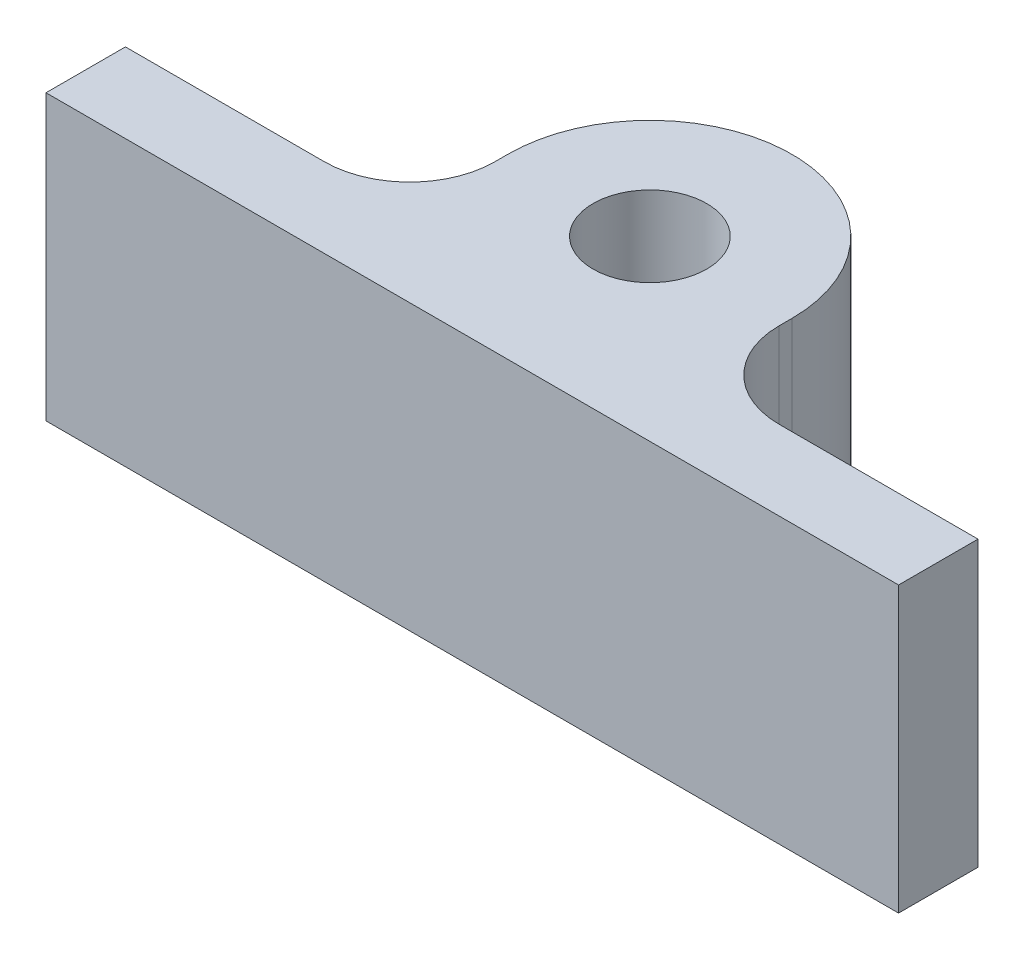
ISO-10303-21;
HEADER;
FILE_DESCRIPTION(('STEP AP214'),'2;1');
FILE_NAME('part.step','',(''),(''),'','','');
FILE_SCHEMA(('AUTOMOTIVE_DESIGN { 1 0 10303 214 1 1 1 1 }'));
ENDSEC;
DATA;
#1=APPLICATION_CONTEXT('core data for automotive mechanical design processes');
#2=APPLICATION_PROTOCOL_DEFINITION('international standard','automotive_design',2000,#1);
#3=PRODUCT_CONTEXT('',#1,'mechanical');
#4=PRODUCT('Part','Part','',(#3));
#5=PRODUCT_RELATED_PRODUCT_CATEGORY('part','',(#4));
#6=PRODUCT_DEFINITION_FORMATION('','',#4);
#7=PRODUCT_DEFINITION_CONTEXT('part definition',#1,'design');
#8=PRODUCT_DEFINITION('design','',#6,#7);
#9=PRODUCT_DEFINITION_SHAPE('','',#8);
#10=(LENGTH_UNIT() NAMED_UNIT(*) SI_UNIT(.MILLI.,.METRE.));
#11=(NAMED_UNIT(*) PLANE_ANGLE_UNIT() SI_UNIT($,.RADIAN.));
#12=(NAMED_UNIT(*) SI_UNIT($,.STERADIAN.) SOLID_ANGLE_UNIT());
#13=UNCERTAINTY_MEASURE_WITH_UNIT(LENGTH_MEASURE(1.E-05),#10,'distance_accuracy_value','');
#14=(GEOMETRIC_REPRESENTATION_CONTEXT(3) GLOBAL_UNCERTAINTY_ASSIGNED_CONTEXT((#13)) GLOBAL_UNIT_ASSIGNED_CONTEXT((#10,
#11,#12)) REPRESENTATION_CONTEXT('',''));
#15=CARTESIAN_POINT('',(0.,0.,0.));
#16=DIRECTION('',(0.,0.,1.));
#17=DIRECTION('',(1.,0.,0.));
#18=AXIS2_PLACEMENT_3D('',#15,#16,#17);
#19=CARTESIAN_POINT('',(-16.,20.,0.909634979907082));
#20=DIRECTION('',(0.,-1.,0.));
#21=DIRECTION('',(0.,0.,-1.));
#22=AXIS2_PLACEMENT_3D('',#19,#20,#21);
#23=PLANE('',#22);
#24=DIRECTION('',(0.,0.,1.));
#25=VECTOR('',#24,1.);
#26=CARTESIAN_POINT('',(-30.,20.,12.5));
#27=LINE('',#26,#25);
#28=CARTESIAN_POINT('',(-30.,20.,6.90963497990708));
#29=VERTEX_POINT('',#28);
#30=CARTESIAN_POINT('',(-30.,20.,12.5));
#31=VERTEX_POINT('',#30);
#32=EDGE_CURVE('E165',#29,#31,#27,.T.);
#33=ORIENTED_EDGE('',*,*,#32,.T.);
#34=DIRECTION('',(1.,0.,0.));
#35=VECTOR('',#34,1.);
#36=CARTESIAN_POINT('',(30.,20.,12.5));
#37=LINE('',#36,#35);
#38=CARTESIAN_POINT('',(30.,20.,12.5));
#39=VERTEX_POINT('',#38);
#40=EDGE_CURVE('E103',#31,#39,#37,.T.);
#41=ORIENTED_EDGE('',*,*,#40,.T.);
#42=DIRECTION('',(0.,0.,-1.));
#43=VECTOR('',#42,1.);
#44=CARTESIAN_POINT('',(30.,20.,12.5));
#45=LINE('',#44,#43);
#46=CARTESIAN_POINT('',(30.,20.,6.90963497990707));
#47=VERTEX_POINT('',#46);
#48=EDGE_CURVE('E186',#39,#47,#45,.T.);
#49=ORIENTED_EDGE('',*,*,#48,.T.);
#50=DIRECTION('',(-1.,0.,0.));
#51=VECTOR('',#50,1.);
#52=CARTESIAN_POINT('',(16.,20.,6.90963497990708));
#53=LINE('',#52,#51);
#54=CARTESIAN_POINT('',(16.,20.,6.90963497990708));
#55=VERTEX_POINT('',#54);
#56=EDGE_CURVE('E205',#47,#55,#53,.T.);
#57=ORIENTED_EDGE('',*,*,#56,.T.);
#58=CARTESIAN_POINT('',(16.,20.,0.909634979907076));
#59=DIRECTION('',(0.,-1.,0.));
#60=DIRECTION('',(0.,0.,1.));
#61=AXIS2_PLACEMENT_3D('',#58,#59,#60);
#62=CIRCLE('',#61,6.);
#63=CARTESIAN_POINT('',(10.,20.,0.909634979907032));
#64=VERTEX_POINT('',#63);
#65=EDGE_CURVE('E202',#55,#64,#62,.T.);
#66=ORIENTED_EDGE('',*,*,#65,.T.);
#67=DIRECTION('',(0.,0.,-1.));
#68=VECTOR('',#67,1.);
#69=CARTESIAN_POINT('',(10.,20.,0.));
#70=LINE('',#69,#68);
#71=CARTESIAN_POINT('',(10.,20.,0.));
#72=VERTEX_POINT('',#71);
#73=EDGE_CURVE('E204',#64,#72,#70,.T.);
#74=ORIENTED_EDGE('',*,*,#73,.T.);
#75=CARTESIAN_POINT('',(0.,20.,0.));
#76=DIRECTION('',(0.,1.,0.));
#77=DIRECTION('',(0.,0.,1.));
#78=AXIS2_PLACEMENT_3D('',#75,#76,#77);
#79=CIRCLE('',#78,10.);
#80=CARTESIAN_POINT('',(-10.,20.,0.));
#81=VERTEX_POINT('',#80);
#82=EDGE_CURVE('E128',#72,#81,#79,.T.);
#83=ORIENTED_EDGE('',*,*,#82,.T.);
#84=DIRECTION('',(0.,0.,1.));
#85=VECTOR('',#84,1.);
#86=CARTESIAN_POINT('',(-10.,20.,0.));
#87=LINE('',#86,#85);
#88=CARTESIAN_POINT('',(-10.,20.,0.909634979907039));
#89=VERTEX_POINT('',#88);
#90=EDGE_CURVE('E122',#81,#89,#87,.T.);
#91=ORIENTED_EDGE('',*,*,#90,.T.);
#92=CARTESIAN_POINT('',(-16.,20.,0.909634979907082));
#93=DIRECTION('',(0.,-1.,0.));
#94=DIRECTION('',(0.,0.,-1.));
#95=AXIS2_PLACEMENT_3D('',#92,#93,#94);
#96=CIRCLE('',#95,6.);
#97=CARTESIAN_POINT('',(-16.,20.,6.90963497990708));
#98=VERTEX_POINT('',#97);
#99=EDGE_CURVE('E126',#89,#98,#96,.T.);
#100=ORIENTED_EDGE('',*,*,#99,.T.);
#101=DIRECTION('',(-1.,0.,0.));
#102=VECTOR('',#101,1.);
#103=CARTESIAN_POINT('',(-30.,20.,6.90963497990708));
#104=LINE('',#103,#102);
#105=EDGE_CURVE('E54',#98,#29,#104,.T.);
#106=ORIENTED_EDGE('',*,*,#105,.T.);
#107=EDGE_LOOP('',(#33,#41,#49,#57,#66,#74,#83,#91,#100,#106));
#108=FACE_BOUND('',#107,.T.);
#109=CARTESIAN_POINT('',(0.,20.,0.));
#110=DIRECTION('',(0.,1.,0.));
#111=DIRECTION('',(0.,0.,1.));
#112=AXIS2_PLACEMENT_3D('',#109,#110,#111);
#113=CIRCLE('',#112,4.);
#114=CARTESIAN_POINT('',(0.,20.,4.));
#115=VERTEX_POINT('',#114);
#116=EDGE_CURVE('E150',#115,#115,#113,.T.);
#117=ORIENTED_EDGE('',*,*,#116,.F.);
#118=EDGE_LOOP('',(#117));
#119=FACE_BOUND('',#118,.T.);
#120=ADVANCED_FACE('F37',(#108,#119),#23,.F.);
#121=CARTESIAN_POINT('',(-16.,0.,0.909634979907082));
#122=DIRECTION('',(0.,-1.,0.));
#123=DIRECTION('',(0.,0.,-1.));
#124=AXIS2_PLACEMENT_3D('',#121,#122,#123);
#125=PLANE('',#124);
#126=DIRECTION('',(0.,0.,1.));
#127=VECTOR('',#126,1.);
#128=CARTESIAN_POINT('',(-30.,0.,12.5));
#129=LINE('',#128,#127);
#130=CARTESIAN_POINT('',(-30.,0.,6.90963497990708));
#131=VERTEX_POINT('',#130);
#132=CARTESIAN_POINT('',(-30.,0.,12.5));
#133=VERTEX_POINT('',#132);
#134=EDGE_CURVE('E146',#131,#133,#129,.T.);
#135=ORIENTED_EDGE('',*,*,#134,.F.);
#136=DIRECTION('',(-1.,0.,0.));
#137=VECTOR('',#136,1.);
#138=CARTESIAN_POINT('',(-30.,0.,6.90963497990708));
#139=LINE('',#138,#137);
#140=CARTESIAN_POINT('',(-16.,0.,6.90963497990708));
#141=VERTEX_POINT('',#140);
#142=EDGE_CURVE('E95',#141,#131,#139,.T.);
#143=ORIENTED_EDGE('',*,*,#142,.F.);
#144=CARTESIAN_POINT('',(-16.,0.,0.909634979907082));
#145=DIRECTION('',(0.,-1.,0.));
#146=DIRECTION('',(0.,0.,-1.));
#147=AXIS2_PLACEMENT_3D('',#144,#145,#146);
#148=CIRCLE('',#147,6.);
#149=CARTESIAN_POINT('',(-10.,0.,0.909634979907039));
#150=VERTEX_POINT('',#149);
#151=EDGE_CURVE('E89',#150,#141,#148,.T.);
#152=ORIENTED_EDGE('',*,*,#151,.F.);
#153=DIRECTION('',(0.,0.,1.));
#154=VECTOR('',#153,1.);
#155=CARTESIAN_POINT('',(-10.,0.,0.));
#156=LINE('',#155,#154);
#157=CARTESIAN_POINT('',(-10.,0.,0.));
#158=VERTEX_POINT('',#157);
#159=EDGE_CURVE('E136',#158,#150,#156,.T.);
#160=ORIENTED_EDGE('',*,*,#159,.F.);
#161=CARTESIAN_POINT('',(0.,0.,0.));
#162=DIRECTION('',(0.,1.,0.));
#163=DIRECTION('',(0.,0.,1.));
#164=AXIS2_PLACEMENT_3D('',#161,#162,#163);
#165=CIRCLE('',#164,10.);
#166=CARTESIAN_POINT('',(10.,0.,0.));
#167=VERTEX_POINT('',#166);
#168=EDGE_CURVE('E160',#167,#158,#165,.T.);
#169=ORIENTED_EDGE('',*,*,#168,.F.);
#170=DIRECTION('',(0.,0.,-1.));
#171=VECTOR('',#170,1.);
#172=CARTESIAN_POINT('',(10.,0.,0.));
#173=LINE('',#172,#171);
#174=CARTESIAN_POINT('',(10.,0.,0.909634979907032));
#175=VERTEX_POINT('',#174);
#176=EDGE_CURVE('E158',#175,#167,#173,.T.);
#177=ORIENTED_EDGE('',*,*,#176,.F.);
#178=CARTESIAN_POINT('',(16.,0.,0.909634979907076));
#179=DIRECTION('',(0.,-1.,0.));
#180=DIRECTION('',(0.,0.,1.));
#181=AXIS2_PLACEMENT_3D('',#178,#179,#180);
#182=CIRCLE('',#181,6.);
#183=CARTESIAN_POINT('',(16.,0.,6.90963497990708));
#184=VERTEX_POINT('',#183);
#185=EDGE_CURVE('E156',#184,#175,#182,.T.);
#186=ORIENTED_EDGE('',*,*,#185,.F.);
#187=DIRECTION('',(-1.,0.,0.));
#188=VECTOR('',#187,1.);
#189=CARTESIAN_POINT('',(16.,0.,6.90963497990708));
#190=LINE('',#189,#188);
#191=CARTESIAN_POINT('',(30.,0.,6.90963497990707));
#192=VERTEX_POINT('',#191);
#193=EDGE_CURVE('E154',#192,#184,#190,.T.);
#194=ORIENTED_EDGE('',*,*,#193,.F.);
#195=DIRECTION('',(0.,0.,-1.));
#196=VECTOR('',#195,1.);
#197=CARTESIAN_POINT('',(30.,0.,12.5));
#198=LINE('',#197,#196);
#199=CARTESIAN_POINT('',(30.,0.,12.5));
#200=VERTEX_POINT('',#199);
#201=EDGE_CURVE('E152',#200,#192,#198,.T.);
#202=ORIENTED_EDGE('',*,*,#201,.F.);
#203=DIRECTION('',(1.,0.,0.));
#204=VECTOR('',#203,1.);
#205=CARTESIAN_POINT('',(30.,0.,12.5));
#206=LINE('',#205,#204);
#207=EDGE_CURVE('E149',#133,#200,#206,.T.);
#208=ORIENTED_EDGE('',*,*,#207,.F.);
#209=EDGE_LOOP('',(#135,#143,#152,#160,#169,#177,#186,#194,#202,#208));
#210=FACE_BOUND('',#209,.T.);
#211=CARTESIAN_POINT('',(0.,0.,0.));
#212=DIRECTION('',(0.,1.,0.));
#213=DIRECTION('',(0.,0.,1.));
#214=AXIS2_PLACEMENT_3D('',#211,#212,#213);
#215=CIRCLE('',#214,4.);
#216=CARTESIAN_POINT('',(0.,0.,4.));
#217=VERTEX_POINT('',#216);
#218=EDGE_CURVE('E213',#217,#217,#215,.T.);
#219=ORIENTED_EDGE('',*,*,#218,.T.);
#220=EDGE_LOOP('',(#219));
#221=FACE_BOUND('',#220,.T.);
#222=ADVANCED_FACE('F190',(#210,#221),#125,.T.);
#223=CARTESIAN_POINT('',(-30.,20.,12.5));
#224=DIRECTION('',(1.,0.,0.));
#225=DIRECTION('',(0.,0.,-1.));
#226=AXIS2_PLACEMENT_3D('',#223,#224,#225);
#227=PLANE('',#226);
#228=ORIENTED_EDGE('',*,*,#134,.T.);
#229=DIRECTION('',(0.,-1.,0.));
#230=VECTOR('',#229,1.);
#231=CARTESIAN_POINT('',(-30.,20.,12.5));
#232=LINE('',#231,#230);
#233=EDGE_CURVE('E11',#31,#133,#232,.T.);
#234=ORIENTED_EDGE('',*,*,#233,.F.);
#235=ORIENTED_EDGE('',*,*,#32,.F.);
#236=DIRECTION('',(0.,-1.,0.));
#237=VECTOR('',#236,1.);
#238=CARTESIAN_POINT('',(-30.,20.,6.90963497990708));
#239=LINE('',#238,#237);
#240=EDGE_CURVE('E142',#29,#131,#239,.T.);
#241=ORIENTED_EDGE('',*,*,#240,.T.);
#242=EDGE_LOOP('',(#228,#234,#235,#241));
#243=FACE_BOUND('',#242,.T.);
#244=ADVANCED_FACE('F39',(#243),#227,.F.);
#245=CARTESIAN_POINT('',(30.,20.,12.5));
#246=DIRECTION('',(0.,0.,-1.));
#247=DIRECTION('',(-1.,0.,0.));
#248=AXIS2_PLACEMENT_3D('',#245,#246,#247);
#249=PLANE('',#248);
#250=ORIENTED_EDGE('',*,*,#207,.T.);
#251=DIRECTION('',(0.,-1.,0.));
#252=VECTOR('',#251,1.);
#253=CARTESIAN_POINT('',(30.,20.,12.5));
#254=LINE('',#253,#252);
#255=EDGE_CURVE('E46',#39,#200,#254,.T.);
#256=ORIENTED_EDGE('',*,*,#255,.F.);
#257=ORIENTED_EDGE('',*,*,#40,.F.);
#258=ORIENTED_EDGE('',*,*,#233,.T.);
#259=EDGE_LOOP('',(#250,#256,#257,#258));
#260=FACE_BOUND('',#259,.T.);
#261=ADVANCED_FACE('F249',(#260),#249,.F.);
#262=CARTESIAN_POINT('',(30.,20.,12.5));
#263=DIRECTION('',(-1.,0.,0.));
#264=DIRECTION('',(0.,0.,1.));
#265=AXIS2_PLACEMENT_3D('',#262,#263,#264);
#266=PLANE('',#265);
#267=ORIENTED_EDGE('',*,*,#201,.T.);
#268=DIRECTION('',(0.,-1.,0.));
#269=VECTOR('',#268,1.);
#270=CARTESIAN_POINT('',(30.,20.,6.90963497990707));
#271=LINE('',#270,#269);
#272=EDGE_CURVE('E178',#47,#192,#271,.T.);
#273=ORIENTED_EDGE('',*,*,#272,.F.);
#274=ORIENTED_EDGE('',*,*,#48,.F.);
#275=ORIENTED_EDGE('',*,*,#255,.T.);
#276=EDGE_LOOP('',(#267,#273,#274,#275));
#277=FACE_BOUND('',#276,.T.);
#278=ADVANCED_FACE('F184',(#277),#266,.F.);
#279=CARTESIAN_POINT('',(16.,20.,6.90963497990708));
#280=DIRECTION('',(0.,0.,1.));
#281=DIRECTION('',(1.,0.,0.));
#282=AXIS2_PLACEMENT_3D('',#279,#280,#281);
#283=PLANE('',#282);
#284=ORIENTED_EDGE('',*,*,#193,.T.);
#285=DIRECTION('',(0.,-1.,0.));
#286=VECTOR('',#285,1.);
#287=CARTESIAN_POINT('',(16.,20.,6.90963497990708));
#288=LINE('',#287,#286);
#289=EDGE_CURVE('E175',#55,#184,#288,.T.);
#290=ORIENTED_EDGE('',*,*,#289,.F.);
#291=ORIENTED_EDGE('',*,*,#56,.F.);
#292=ORIENTED_EDGE('',*,*,#272,.T.);
#293=EDGE_LOOP('',(#284,#290,#291,#292));
#294=FACE_BOUND('',#293,.T.);
#295=ADVANCED_FACE('F196',(#294),#283,.F.);
#296=CARTESIAN_POINT('',(16.,20.,0.909634979907076));
#297=DIRECTION('',(0.,-1.,0.));
#298=DIRECTION('',(0.,0.,-1.));
#299=AXIS2_PLACEMENT_3D('',#296,#297,#298);
#300=CYLINDRICAL_SURFACE('',#299,6.);
#301=ORIENTED_EDGE('',*,*,#185,.T.);
#302=DIRECTION('',(0.,-1.,0.));
#303=VECTOR('',#302,1.);
#304=CARTESIAN_POINT('',(10.,20.,0.909634979907032));
#305=LINE('',#304,#303);
#306=EDGE_CURVE('E172',#64,#175,#305,.T.);
#307=ORIENTED_EDGE('',*,*,#306,.F.);
#308=ORIENTED_EDGE('',*,*,#65,.F.);
#309=ORIENTED_EDGE('',*,*,#289,.T.);
#310=EDGE_LOOP('',(#301,#307,#308,#309));
#311=FACE_BOUND('',#310,.T.);
#312=ADVANCED_FACE('F200',(#311),#300,.F.);
#313=CARTESIAN_POINT('',(10.,20.,0.));
#314=DIRECTION('',(-1.,0.,0.));
#315=DIRECTION('',(0.,0.,1.));
#316=AXIS2_PLACEMENT_3D('',#313,#314,#315);
#317=PLANE('',#316);
#318=ORIENTED_EDGE('',*,*,#176,.T.);
#319=DIRECTION('',(0.,-1.,0.));
#320=VECTOR('',#319,1.);
#321=CARTESIAN_POINT('',(10.,20.,0.));
#322=LINE('',#321,#320);
#323=EDGE_CURVE('E169',#72,#167,#322,.T.);
#324=ORIENTED_EDGE('',*,*,#323,.F.);
#325=ORIENTED_EDGE('',*,*,#73,.F.);
#326=ORIENTED_EDGE('',*,*,#306,.T.);
#327=EDGE_LOOP('',(#318,#324,#325,#326));
#328=FACE_BOUND('',#327,.T.);
#329=ADVANCED_FACE('F239',(#328),#317,.F.);
#330=CARTESIAN_POINT('',(0.,20.,0.));
#331=DIRECTION('',(0.,-1.,0.));
#332=DIRECTION('',(0.,0.,-1.));
#333=AXIS2_PLACEMENT_3D('',#330,#331,#332);
#334=CYLINDRICAL_SURFACE('',#333,10.);
#335=ORIENTED_EDGE('',*,*,#168,.T.);
#336=DIRECTION('',(0.,-1.,0.));
#337=VECTOR('',#336,1.);
#338=CARTESIAN_POINT('',(-10.,20.,0.));
#339=LINE('',#338,#337);
#340=EDGE_CURVE('E137',#81,#158,#339,.T.);
#341=ORIENTED_EDGE('',*,*,#340,.F.);
#342=ORIENTED_EDGE('',*,*,#82,.F.);
#343=ORIENTED_EDGE('',*,*,#323,.T.);
#344=EDGE_LOOP('',(#335,#341,#342,#343));
#345=FACE_BOUND('',#344,.T.);
#346=ADVANCED_FACE('F236',(#345),#334,.T.);
#347=CARTESIAN_POINT('',(-10.,20.,0.));
#348=DIRECTION('',(1.,0.,0.));
#349=DIRECTION('',(0.,0.,-1.));
#350=AXIS2_PLACEMENT_3D('',#347,#348,#349);
#351=PLANE('',#350);
#352=ORIENTED_EDGE('',*,*,#159,.T.);
#353=DIRECTION('',(0.,-1.,0.));
#354=VECTOR('',#353,1.);
#355=CARTESIAN_POINT('',(-10.,20.,0.909634979907039));
#356=LINE('',#355,#354);
#357=EDGE_CURVE('E133',#89,#150,#356,.T.);
#358=ORIENTED_EDGE('',*,*,#357,.F.);
#359=ORIENTED_EDGE('',*,*,#90,.F.);
#360=ORIENTED_EDGE('',*,*,#340,.T.);
#361=EDGE_LOOP('',(#352,#358,#359,#360));
#362=FACE_BOUND('',#361,.T.);
#363=ADVANCED_FACE('F134',(#362),#351,.F.);
#364=CARTESIAN_POINT('',(-16.,20.,0.909634979907082));
#365=DIRECTION('',(0.,-1.,0.));
#366=DIRECTION('',(0.,0.,-1.));
#367=AXIS2_PLACEMENT_3D('',#364,#365,#366);
#368=CYLINDRICAL_SURFACE('',#367,6.);
#369=ORIENTED_EDGE('',*,*,#151,.T.);
#370=DIRECTION('',(0.,-1.,0.));
#371=VECTOR('',#370,1.);
#372=CARTESIAN_POINT('',(-16.,20.,6.90963497990708));
#373=LINE('',#372,#371);
#374=EDGE_CURVE('E138',#98,#141,#373,.T.);
#375=ORIENTED_EDGE('',*,*,#374,.F.);
#376=ORIENTED_EDGE('',*,*,#99,.F.);
#377=ORIENTED_EDGE('',*,*,#357,.T.);
#378=EDGE_LOOP('',(#369,#375,#376,#377));
#379=FACE_BOUND('',#378,.T.);
#380=ADVANCED_FACE('F140',(#379),#368,.F.);
#381=CARTESIAN_POINT('',(-30.,20.,6.90963497990708));
#382=DIRECTION('',(0.,0.,1.));
#383=DIRECTION('',(1.,0.,0.));
#384=AXIS2_PLACEMENT_3D('',#381,#382,#383);
#385=PLANE('',#384);
#386=ORIENTED_EDGE('',*,*,#142,.T.);
#387=ORIENTED_EDGE('',*,*,#240,.F.);
#388=ORIENTED_EDGE('',*,*,#105,.F.);
#389=ORIENTED_EDGE('',*,*,#374,.T.);
#390=EDGE_LOOP('',(#386,#387,#388,#389));
#391=FACE_BOUND('',#390,.T.);
#392=ADVANCED_FACE('F229',(#391),#385,.F.);
#393=CARTESIAN_POINT('',(0.,20.,0.));
#394=DIRECTION('',(0.,-1.,0.));
#395=DIRECTION('',(0.,0.,-1.));
#396=AXIS2_PLACEMENT_3D('',#393,#394,#395);
#397=CYLINDRICAL_SURFACE('',#396,4.);
#398=ORIENTED_EDGE('',*,*,#116,.T.);
#399=EDGE_LOOP('',(#398));
#400=FACE_BOUND('',#399,.T.);
#401=ORIENTED_EDGE('',*,*,#218,.F.);
#402=EDGE_LOOP('',(#401));
#403=FACE_BOUND('',#402,.T.);
#404=ADVANCED_FACE('F219',(#400,#403),#397,.F.);
#405=CLOSED_SHELL('',(#120,#222,#244,#261,#278,#295,#312,#329,#346,#363,#380,#392,#404));
#406=MANIFOLD_SOLID_BREP('B2',#405);
#407=ADVANCED_BREP_SHAPE_REPRESENTATION('',(#18,#406),#14);
#408=SHAPE_DEFINITION_REPRESENTATION(#9,#407);
ENDSEC;
END-ISO-10303-21;
